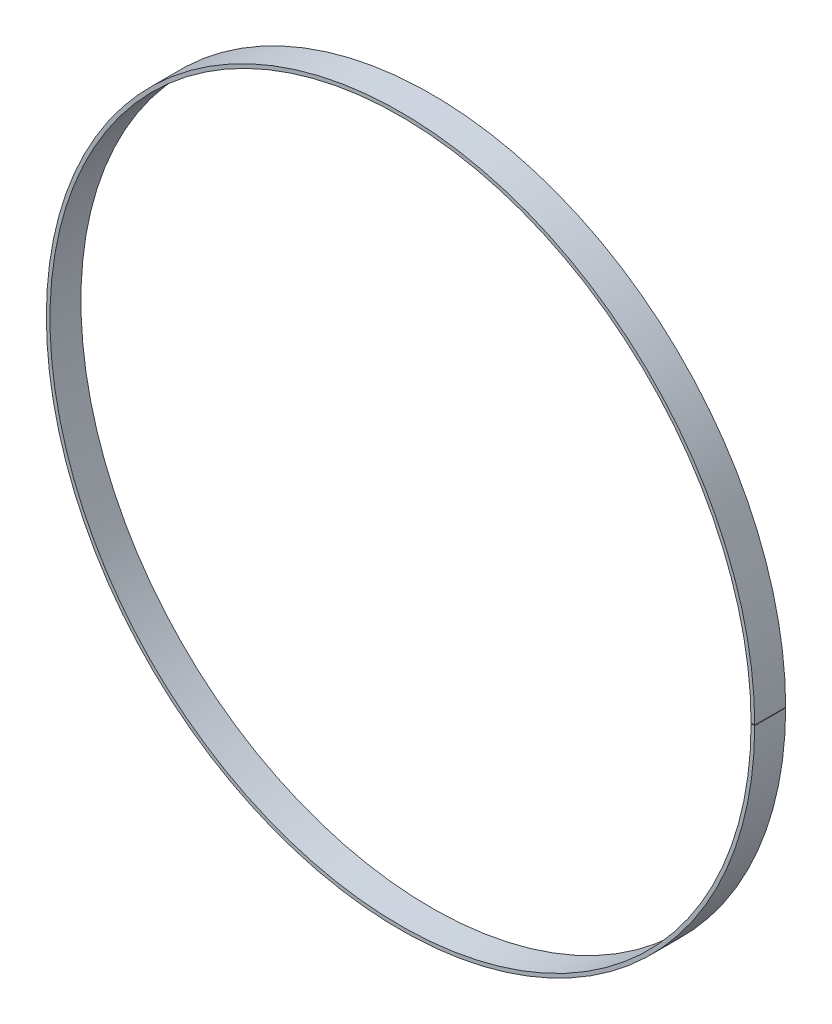
ISO-10303-21;
HEADER;
FILE_DESCRIPTION(('STEP AP214'),'2;1');
FILE_NAME('part.step','',(''),(''),'','','');
FILE_SCHEMA(('AUTOMOTIVE_DESIGN { 1 0 10303 214 1 1 1 1 }'));
ENDSEC;
DATA;
#1=APPLICATION_CONTEXT('core data for automotive mechanical design processes');
#2=APPLICATION_PROTOCOL_DEFINITION('international standard','automotive_design',2000,#1);
#3=PRODUCT_CONTEXT('',#1,'mechanical');
#4=PRODUCT('Part','Part','',(#3));
#5=PRODUCT_RELATED_PRODUCT_CATEGORY('part','',(#4));
#6=PRODUCT_DEFINITION_FORMATION('','',#4);
#7=PRODUCT_DEFINITION_CONTEXT('part definition',#1,'design');
#8=PRODUCT_DEFINITION('design','',#6,#7);
#9=PRODUCT_DEFINITION_SHAPE('','',#8);
#10=(LENGTH_UNIT() NAMED_UNIT(*) SI_UNIT(.MILLI.,.METRE.));
#11=(NAMED_UNIT(*) PLANE_ANGLE_UNIT() SI_UNIT($,.RADIAN.));
#12=(NAMED_UNIT(*) SI_UNIT($,.STERADIAN.) SOLID_ANGLE_UNIT());
#13=UNCERTAINTY_MEASURE_WITH_UNIT(LENGTH_MEASURE(1.E-05),#10,'distance_accuracy_value','');
#14=(GEOMETRIC_REPRESENTATION_CONTEXT(3) GLOBAL_UNCERTAINTY_ASSIGNED_CONTEXT((#13)) GLOBAL_UNIT_ASSIGNED_CONTEXT((#10,
#11,#12)) REPRESENTATION_CONTEXT('',''));
#15=CARTESIAN_POINT('',(0.,0.,0.));
#16=DIRECTION('',(0.,0.,1.));
#17=DIRECTION('',(1.,0.,0.));
#18=AXIS2_PLACEMENT_3D('',#15,#16,#17);
#19=CARTESIAN_POINT('',(0.,0.,13.5));
#20=DIRECTION('',(0.,0.,-1.));
#21=DIRECTION('',(-1.,0.,0.));
#22=AXIS2_PLACEMENT_3D('',#19,#20,#21);
#23=CYLINDRICAL_SURFACE('',#22,153.);
#24=CARTESIAN_POINT('',(0.,0.,0.));
#25=DIRECTION('',(0.,0.,-1.));
#26=DIRECTION('',(1.,0.,0.));
#27=AXIS2_PLACEMENT_3D('',#24,#25,#26);
#28=CIRCLE('',#27,153.);
#29=CARTESIAN_POINT('',(152.999949981256,-0.123716341877577,0.));
#30=VERTEX_POINT('',#29);
#31=CARTESIAN_POINT('',(152.999949981256,0.123716341877577,0.));
#32=VERTEX_POINT('',#31);
#33=EDGE_CURVE('E107',#30,#32,#28,.T.);
#34=ORIENTED_EDGE('',*,*,#33,.T.);
#35=DIRECTION('',(0.,0.,-1.));
#36=VECTOR('',#35,1.);
#37=CARTESIAN_POINT('',(152.999949981256,0.123716341877577,13.5));
#38=LINE('',#37,#36);
#39=CARTESIAN_POINT('',(152.999949981256,0.123716341877577,13.5));
#40=VERTEX_POINT('',#39);
#41=EDGE_CURVE('E11',#40,#32,#38,.T.);
#42=ORIENTED_EDGE('',*,*,#41,.F.);
#43=CARTESIAN_POINT('',(0.,0.,13.5));
#44=DIRECTION('',(0.,0.,-1.));
#45=DIRECTION('',(1.,0.,0.));
#46=AXIS2_PLACEMENT_3D('',#43,#44,#45);
#47=CIRCLE('',#46,153.);
#48=CARTESIAN_POINT('',(152.999949981256,-0.123716341877577,13.5));
#49=VERTEX_POINT('',#48);
#50=EDGE_CURVE('E91',#49,#40,#47,.T.);
#51=ORIENTED_EDGE('',*,*,#50,.F.);
#52=DIRECTION('',(0.,0.,-1.));
#53=VECTOR('',#52,1.);
#54=CARTESIAN_POINT('',(152.999949981256,-0.123716341877577,13.5));
#55=LINE('',#54,#53);
#56=EDGE_CURVE('E103',#49,#30,#55,.T.);
#57=ORIENTED_EDGE('',*,*,#56,.T.);
#58=EDGE_LOOP('',(#34,#42,#51,#57));
#59=FACE_BOUND('',#58,.T.);
#60=ADVANCED_FACE('F39',(#59),#23,.F.);
#61=CARTESIAN_POINT('',(152.999949981256,0.123716341877577,13.5));
#62=DIRECTION('',(-0.000808603541683502,0.999999673080103,0.));
#63=DIRECTION('',(-0.999999673080103,-0.000808603541683502,0.));
#64=AXIS2_PLACEMENT_3D('',#61,#62,#63);
#65=PLANE('',#64);
#66=DIRECTION('',(0.999999673080103,0.000808603541683502,0.));
#67=VECTOR('',#66,1.);
#68=CARTESIAN_POINT('',(152.999949981256,0.123716341877577,0.));
#69=LINE('',#68,#67);
#70=CARTESIAN_POINT('',(154.58744946227,0.125,0.));
#71=VERTEX_POINT('',#70);
#72=EDGE_CURVE('E96',#32,#71,#69,.T.);
#73=ORIENTED_EDGE('',*,*,#72,.T.);
#74=DIRECTION('',(0.,0.,-1.));
#75=VECTOR('',#74,1.);
#76=CARTESIAN_POINT('',(154.58744946227,0.125,13.5));
#77=LINE('',#76,#75);
#78=CARTESIAN_POINT('',(154.58744946227,0.125,13.5));
#79=VERTEX_POINT('',#78);
#80=EDGE_CURVE('E48',#79,#71,#77,.T.);
#81=ORIENTED_EDGE('',*,*,#80,.F.);
#82=DIRECTION('',(0.999999673080103,0.000808603541683502,0.));
#83=VECTOR('',#82,1.);
#84=CARTESIAN_POINT('',(152.999949981256,0.123716341877577,13.5));
#85=LINE('',#84,#83);
#86=EDGE_CURVE('E86',#40,#79,#85,.T.);
#87=ORIENTED_EDGE('',*,*,#86,.F.);
#88=ORIENTED_EDGE('',*,*,#41,.T.);
#89=EDGE_LOOP('',(#73,#81,#87,#88));
#90=FACE_BOUND('',#89,.T.);
#91=ADVANCED_FACE('F95',(#90),#65,.F.);
#92=CARTESIAN_POINT('',(0.,0.,13.5));
#93=DIRECTION('',(0.,0.,-1.));
#94=DIRECTION('',(-1.,0.,0.));
#95=AXIS2_PLACEMENT_3D('',#92,#93,#94);
#96=CYLINDRICAL_SURFACE('',#95,154.5875);
#97=CARTESIAN_POINT('',(0.,0.,0.));
#98=DIRECTION('',(0.,0.,1.));
#99=DIRECTION('',(1.,0.,0.));
#100=AXIS2_PLACEMENT_3D('',#97,#98,#99);
#101=CIRCLE('',#100,154.5875);
#102=CARTESIAN_POINT('',(154.58744946227,-0.125000000000022,0.));
#103=VERTEX_POINT('',#102);
#104=EDGE_CURVE('E73',#71,#103,#101,.T.);
#105=ORIENTED_EDGE('',*,*,#104,.T.);
#106=DIRECTION('',(0.,0.,-1.));
#107=VECTOR('',#106,1.);
#108=CARTESIAN_POINT('',(154.58744946227,-0.125000000000022,13.5));
#109=LINE('',#108,#107);
#110=CARTESIAN_POINT('',(154.58744946227,-0.125000000000022,13.5));
#111=VERTEX_POINT('',#110);
#112=EDGE_CURVE('E98',#111,#103,#109,.T.);
#113=ORIENTED_EDGE('',*,*,#112,.F.);
#114=CARTESIAN_POINT('',(0.,0.,13.5));
#115=DIRECTION('',(0.,0.,1.));
#116=DIRECTION('',(1.,0.,0.));
#117=AXIS2_PLACEMENT_3D('',#114,#115,#116);
#118=CIRCLE('',#117,154.5875);
#119=EDGE_CURVE('E89',#79,#111,#118,.T.);
#120=ORIENTED_EDGE('',*,*,#119,.F.);
#121=ORIENTED_EDGE('',*,*,#80,.T.);
#122=EDGE_LOOP('',(#105,#113,#120,#121));
#123=FACE_BOUND('',#122,.T.);
#124=ADVANCED_FACE('F99',(#123),#96,.T.);
#125=CARTESIAN_POINT('',(152.999949981256,-0.123716341877577,13.5));
#126=DIRECTION('',(-0.000808603541683502,-0.999999673080103,0.));
#127=DIRECTION('',(0.999999673080103,-0.000808603541683502,0.));
#128=AXIS2_PLACEMENT_3D('',#125,#126,#127);
#129=PLANE('',#128);
#130=DIRECTION('',(-0.999999673080103,0.000808603541683502,0.));
#131=VECTOR('',#130,1.);
#132=CARTESIAN_POINT('',(152.999949981256,-0.123716341877577,0.));
#133=LINE('',#132,#131);
#134=EDGE_CURVE('E79',#103,#30,#133,.T.);
#135=ORIENTED_EDGE('',*,*,#134,.T.);
#136=ORIENTED_EDGE('',*,*,#56,.F.);
#137=DIRECTION('',(-0.999999673080103,0.000808603541683502,0.));
#138=VECTOR('',#137,1.);
#139=CARTESIAN_POINT('',(152.999949981256,-0.123716341877577,13.5));
#140=LINE('',#139,#138);
#141=EDGE_CURVE('E56',#111,#49,#140,.T.);
#142=ORIENTED_EDGE('',*,*,#141,.F.);
#143=ORIENTED_EDGE('',*,*,#112,.T.);
#144=EDGE_LOOP('',(#135,#136,#142,#143));
#145=FACE_BOUND('',#144,.T.);
#146=ADVANCED_FACE('F120',(#145),#129,.F.);
#147=CARTESIAN_POINT('',(0.,0.,13.5));
#148=DIRECTION('',(0.,0.,1.));
#149=DIRECTION('',(1.,0.,0.));
#150=AXIS2_PLACEMENT_3D('',#147,#148,#149);
#151=PLANE('',#150);
#152=ORIENTED_EDGE('',*,*,#50,.T.);
#153=ORIENTED_EDGE('',*,*,#86,.T.);
#154=ORIENTED_EDGE('',*,*,#119,.T.);
#155=ORIENTED_EDGE('',*,*,#141,.T.);
#156=EDGE_LOOP('',(#152,#153,#154,#155));
#157=FACE_BOUND('',#156,.T.);
#158=ADVANCED_FACE('F87',(#157),#151,.T.);
#159=CARTESIAN_POINT('',(0.,0.,0.));
#160=DIRECTION('',(0.,0.,1.));
#161=DIRECTION('',(1.,0.,0.));
#162=AXIS2_PLACEMENT_3D('',#159,#160,#161);
#163=PLANE('',#162);
#164=ORIENTED_EDGE('',*,*,#33,.F.);
#165=ORIENTED_EDGE('',*,*,#134,.F.);
#166=ORIENTED_EDGE('',*,*,#104,.F.);
#167=ORIENTED_EDGE('',*,*,#72,.F.);
#168=EDGE_LOOP('',(#164,#165,#166,#167));
#169=FACE_BOUND('',#168,.T.);
#170=ADVANCED_FACE('F123',(#169),#163,.F.);
#171=CLOSED_SHELL('',(#60,#91,#124,#146,#158,#170));
#172=MANIFOLD_SOLID_BREP('B2',#171);
#173=ADVANCED_BREP_SHAPE_REPRESENTATION('',(#18,#172),#14);
#174=SHAPE_DEFINITION_REPRESENTATION(#9,#173);
ENDSEC;
END-ISO-10303-21;
